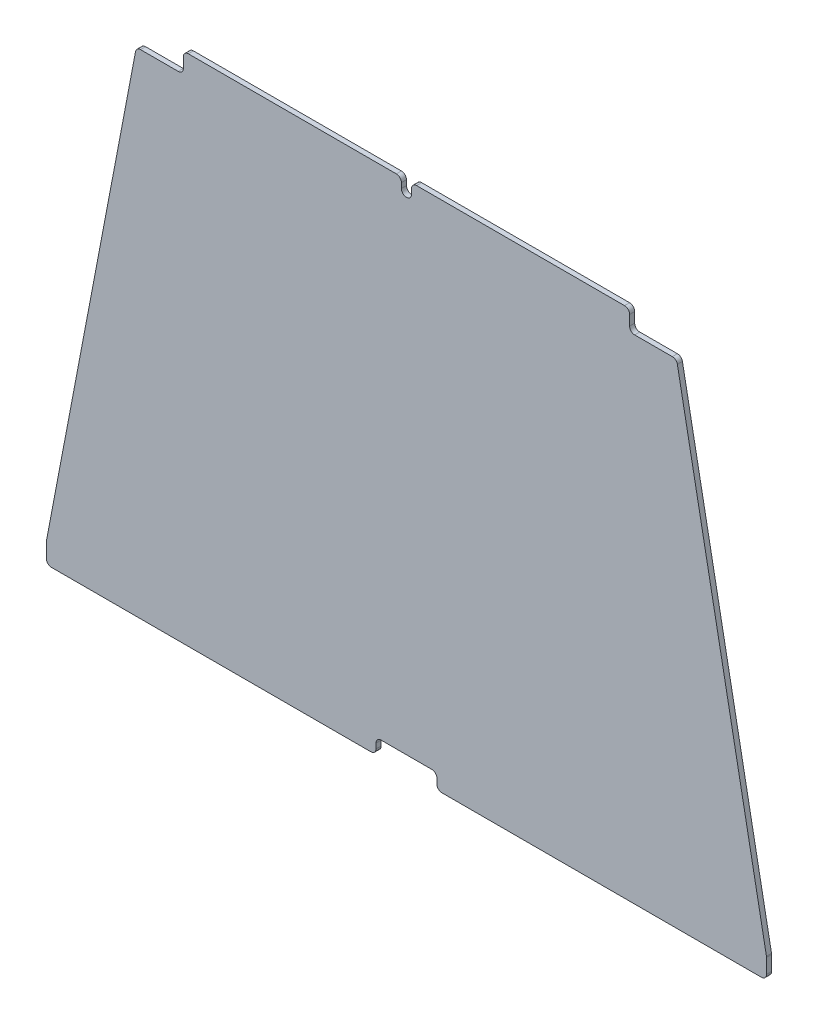
ISO-10303-21;
HEADER;
FILE_DESCRIPTION(('STEP AP214'),'2;1');
FILE_NAME('part.step','',(''),(''),'','','');
FILE_SCHEMA(('AUTOMOTIVE_DESIGN { 1 0 10303 214 1 1 1 1 }'));
ENDSEC;
DATA;
#1=APPLICATION_CONTEXT('core data for automotive mechanical design processes');
#2=APPLICATION_PROTOCOL_DEFINITION('international standard','automotive_design',2000,#1);
#3=PRODUCT_CONTEXT('',#1,'mechanical');
#4=PRODUCT('Part','Part','',(#3));
#5=PRODUCT_RELATED_PRODUCT_CATEGORY('part','',(#4));
#6=PRODUCT_DEFINITION_FORMATION('','',#4);
#7=PRODUCT_DEFINITION_CONTEXT('part definition',#1,'design');
#8=PRODUCT_DEFINITION('design','',#6,#7);
#9=PRODUCT_DEFINITION_SHAPE('','',#8);
#10=(LENGTH_UNIT() NAMED_UNIT(*) SI_UNIT(.MILLI.,.METRE.));
#11=(NAMED_UNIT(*) PLANE_ANGLE_UNIT() SI_UNIT($,.RADIAN.));
#12=(NAMED_UNIT(*) SI_UNIT($,.STERADIAN.) SOLID_ANGLE_UNIT());
#13=UNCERTAINTY_MEASURE_WITH_UNIT(LENGTH_MEASURE(1.E-05),#10,'distance_accuracy_value','');
#14=(GEOMETRIC_REPRESENTATION_CONTEXT(3) GLOBAL_UNCERTAINTY_ASSIGNED_CONTEXT((#13)) GLOBAL_UNIT_ASSIGNED_CONTEXT((#10,
#11,#12)) REPRESENTATION_CONTEXT('',''));
#15=CARTESIAN_POINT('',(0.,0.,0.));
#16=DIRECTION('',(0.,0.,1.));
#17=DIRECTION('',(1.,0.,0.));
#18=AXIS2_PLACEMENT_3D('',#15,#16,#17);
#19=CARTESIAN_POINT('',(355.,0.,5.));
#20=DIRECTION('',(0.,1.,0.));
#21=DIRECTION('',(0.,0.,1.));
#22=AXIS2_PLACEMENT_3D('',#19,#20,#21);
#23=PLANE('',#22);
#24=DIRECTION('',(1.,0.,0.));
#25=VECTOR('',#24,1.);
#26=CARTESIAN_POINT('',(355.,0.,5.));
#27=LINE('',#26,#25);
#28=CARTESIAN_POINT('',(35.0000000000001,0.,5.));
#29=VERTEX_POINT('',#28);
#30=CARTESIAN_POINT('',(350.,0.,5.));
#31=VERTEX_POINT('',#30);
#32=EDGE_CURVE('E371',#29,#31,#27,.T.);
#33=ORIENTED_EDGE('',*,*,#32,.F.);
#34=DIRECTION('',(0.,0.,1.));
#35=VECTOR('',#34,1.);
#36=CARTESIAN_POINT('',(35.0000000000001,0.,0.));
#37=LINE('',#36,#35);
#38=CARTESIAN_POINT('',(35.0000000000001,0.,0.));
#39=VERTEX_POINT('',#38);
#40=EDGE_CURVE('E498',#29,#39,#37,.F.);
#41=ORIENTED_EDGE('',*,*,#40,.T.);
#42=DIRECTION('',(1.,0.,0.));
#43=VECTOR('',#42,1.);
#44=CARTESIAN_POINT('',(355.,0.,0.));
#45=LINE('',#44,#43);
#46=CARTESIAN_POINT('',(350.,0.,0.));
#47=VERTEX_POINT('',#46);
#48=EDGE_CURVE('E451',#39,#47,#45,.T.);
#49=ORIENTED_EDGE('',*,*,#48,.T.);
#50=DIRECTION('',(0.,0.,-1.));
#51=VECTOR('',#50,1.);
#52=CARTESIAN_POINT('',(350.,0.,5.));
#53=LINE('',#52,#51);
#54=EDGE_CURVE('E496',#47,#31,#53,.F.);
#55=ORIENTED_EDGE('',*,*,#54,.T.);
#56=EDGE_LOOP('',(#33,#41,#49,#55));
#57=FACE_BOUND('',#56,.T.);
#58=ADVANCED_FACE('F37',(#57),#23,.F.);
#59=CARTESIAN_POINT('',(355.,19.9999999999999,5.));
#60=DIRECTION('',(-0.982365094756892,-0.186972780380684,0.));
#61=DIRECTION('',(0.186972780380684,-0.982365094756892,0.));
#62=AXIS2_PLACEMENT_3D('',#59,#60,#61);
#63=PLANE('',#62);
#64=DIRECTION('',(-0.186972780380684,0.982365094756892,0.));
#65=VECTOR('',#64,1.);
#66=CARTESIAN_POINT('',(355.,19.9999999999999,0.));
#67=LINE('',#66,#65);
#68=CARTESIAN_POINT('',(354.911825473784,20.4632737269271,0.));
#69=VERTEX_POINT('',#68);
#70=CARTESIAN_POINT('',(267.080298537189,481.934863901903,0.));
#71=VERTEX_POINT('',#70);
#72=EDGE_CURVE('E461',#69,#71,#67,.T.);
#73=ORIENTED_EDGE('',*,*,#72,.T.);
#74=DIRECTION('',(0.,0.,1.));
#75=VECTOR('',#74,1.);
#76=CARTESIAN_POINT('',(267.080298537189,481.934863901903,5.));
#77=LINE('',#76,#75);
#78=CARTESIAN_POINT('',(267.080298537189,481.934863901903,5.));
#79=VERTEX_POINT('',#78);
#80=EDGE_CURVE('E532',#71,#79,#77,.T.);
#81=ORIENTED_EDGE('',*,*,#80,.T.);
#82=DIRECTION('',(-0.186972780380684,0.982365094756892,0.));
#83=VECTOR('',#82,1.);
#84=CARTESIAN_POINT('',(355.,19.9999999999999,5.));
#85=LINE('',#84,#83);
#86=CARTESIAN_POINT('',(354.911825473784,20.4632737269271,5.));
#87=VERTEX_POINT('',#86);
#88=EDGE_CURVE('E313',#87,#79,#85,.T.);
#89=ORIENTED_EDGE('',*,*,#88,.F.);
#90=DIRECTION('',(0.,0.,-1.));
#91=VECTOR('',#90,1.);
#92=CARTESIAN_POINT('',(354.911825473784,20.4632737269271,5.));
#93=LINE('',#92,#91);
#94=EDGE_CURVE('E529',#87,#69,#93,.T.);
#95=ORIENTED_EDGE('',*,*,#94,.T.);
#96=EDGE_LOOP('',(#73,#81,#89,#95));
#97=FACE_BOUND('',#96,.T.);
#98=ADVANCED_FACE('F587',(#97),#63,.F.);
#99=CARTESIAN_POINT('',(-262.5,506.,5.));
#100=DIRECTION('',(0.,-1.,0.));
#101=DIRECTION('',(0.,0.,-1.));
#102=AXIS2_PLACEMENT_3D('',#99,#100,#101);
#103=PLANE('',#102);
#104=DIRECTION('',(-1.,0.,0.));
#105=VECTOR('',#104,1.);
#106=CARTESIAN_POINT('',(-262.5,506.,5.));
#107=LINE('',#106,#105);
#108=CARTESIAN_POINT('',(215.,506.,5.));
#109=VERTEX_POINT('',#108);
#110=CARTESIAN_POINT('',(9.99999999999995,506.,5.));
#111=VERTEX_POINT('',#110);
#112=EDGE_CURVE('E312',#109,#111,#107,.T.);
#113=ORIENTED_EDGE('',*,*,#112,.F.);
#114=DIRECTION('',(0.,0.,1.));
#115=VECTOR('',#114,1.);
#116=CARTESIAN_POINT('',(215.,506.,0.));
#117=LINE('',#116,#115);
#118=CARTESIAN_POINT('',(215.,506.,0.));
#119=VERTEX_POINT('',#118);
#120=EDGE_CURVE('E548',#109,#119,#117,.F.);
#121=ORIENTED_EDGE('',*,*,#120,.T.);
#122=DIRECTION('',(-1.,0.,0.));
#123=VECTOR('',#122,1.);
#124=CARTESIAN_POINT('',(-262.5,506.,0.));
#125=LINE('',#124,#123);
#126=CARTESIAN_POINT('',(9.99999999999995,506.,0.));
#127=VERTEX_POINT('',#126);
#128=EDGE_CURVE('E465',#119,#127,#125,.T.);
#129=ORIENTED_EDGE('',*,*,#128,.T.);
#130=DIRECTION('',(0.,0.,1.));
#131=VECTOR('',#130,1.);
#132=CARTESIAN_POINT('',(9.99999999999995,506.,5.));
#133=LINE('',#132,#131);
#134=EDGE_CURVE('E545',#127,#111,#133,.T.);
#135=ORIENTED_EDGE('',*,*,#134,.T.);
#136=EDGE_LOOP('',(#113,#121,#129,#135));
#137=FACE_BOUND('',#136,.T.);
#138=ADVANCED_FACE('F594',(#137),#103,.F.);
#139=CARTESIAN_POINT('',(-10.0000000000001,506.,5.));
#140=VERTEX_POINT('',#139);
#141=CARTESIAN_POINT('',(-215.,506.,5.));
#142=VERTEX_POINT('',#141);
#143=EDGE_CURVE('E307',#140,#142,#107,.T.);
#144=ORIENTED_EDGE('',*,*,#143,.F.);
#145=DIRECTION('',(0.,0.,1.));
#146=VECTOR('',#145,1.);
#147=CARTESIAN_POINT('',(-10.0000000000001,506.,0.));
#148=LINE('',#147,#146);
#149=CARTESIAN_POINT('',(-10.0000000000001,506.,0.));
#150=VERTEX_POINT('',#149);
#151=EDGE_CURVE('E557',#140,#150,#148,.F.);
#152=ORIENTED_EDGE('',*,*,#151,.T.);
#153=CARTESIAN_POINT('',(-215.,506.,0.));
#154=VERTEX_POINT('',#153);
#155=EDGE_CURVE('E464',#150,#154,#125,.T.);
#156=ORIENTED_EDGE('',*,*,#155,.T.);
#157=DIRECTION('',(0.,0.,1.));
#158=VECTOR('',#157,1.);
#159=CARTESIAN_POINT('',(-215.,506.,5.));
#160=LINE('',#159,#158);
#161=EDGE_CURVE('E554',#154,#142,#160,.T.);
#162=ORIENTED_EDGE('',*,*,#161,.T.);
#163=EDGE_LOOP('',(#144,#152,#156,#162));
#164=FACE_BOUND('',#163,.T.);
#165=ADVANCED_FACE('F571',(#164),#103,.F.);
#166=CARTESIAN_POINT('',(0.,0.,5.));
#167=DIRECTION('',(0.,0.,-1.));
#168=DIRECTION('',(-1.,0.,0.));
#169=AXIS2_PLACEMENT_3D('',#166,#167,#168);
#170=PLANE('',#169);
#171=DIRECTION('',(0.,-1.,0.));
#172=VECTOR('',#171,1.);
#173=CARTESIAN_POINT('',(30.0000000000001,0.,5.));
#174=LINE('',#173,#172);
#175=CARTESIAN_POINT('',(30.0000000000001,10.,5.));
#176=VERTEX_POINT('',#175);
#177=CARTESIAN_POINT('',(30.0000000000001,4.99999999999994,5.));
#178=VERTEX_POINT('',#177);
#179=EDGE_CURVE('E350',#176,#178,#174,.T.);
#180=ORIENTED_EDGE('',*,*,#179,.T.);
#181=CARTESIAN_POINT('',(35.0000000000001,4.99999999999994,5.));
#182=DIRECTION('',(0.,0.,-1.));
#183=DIRECTION('',(-1.,0.,0.));
#184=AXIS2_PLACEMENT_3D('',#181,#182,#183);
#185=CIRCLE('',#184,5.);
#186=EDGE_CURVE('E494',#178,#29,#185,.F.);
#187=ORIENTED_EDGE('',*,*,#186,.T.);
#188=ORIENTED_EDGE('',*,*,#32,.T.);
#189=CARTESIAN_POINT('',(350.,4.99999999999994,5.));
#190=DIRECTION('',(0.,0.,-1.));
#191=DIRECTION('',(-1.,0.,0.));
#192=AXIS2_PLACEMENT_3D('',#189,#190,#191);
#193=CIRCLE('',#192,5.);
#194=CARTESIAN_POINT('',(355.,4.99999999999994,5.));
#195=VERTEX_POINT('',#194);
#196=EDGE_CURVE('E472',#31,#195,#193,.F.);
#197=ORIENTED_EDGE('',*,*,#196,.T.);
#198=DIRECTION('',(0.,1.,0.));
#199=VECTOR('',#198,1.);
#200=CARTESIAN_POINT('',(355.,0.,5.));
#201=LINE('',#200,#199);
#202=CARTESIAN_POINT('',(355.,19.5284098250237,5.));
#203=VERTEX_POINT('',#202);
#204=EDGE_CURVE('E654',#195,#203,#201,.T.);
#205=ORIENTED_EDGE('',*,*,#204,.T.);
#206=CARTESIAN_POINT('',(350.,19.5284098250237,5.));
#207=DIRECTION('',(0.,0.,-1.));
#208=DIRECTION('',(-1.,0.,0.));
#209=AXIS2_PLACEMENT_3D('',#206,#207,#208);
#210=CIRCLE('',#209,5.);
#211=EDGE_CURVE('E478',#203,#87,#210,.F.);
#212=ORIENTED_EDGE('',*,*,#211,.T.);
#213=ORIENTED_EDGE('',*,*,#88,.T.);
#214=CARTESIAN_POINT('',(262.168473063405,481.,5.));
#215=DIRECTION('',(0.,0.,-1.));
#216=DIRECTION('',(-1.,0.,0.));
#217=AXIS2_PLACEMENT_3D('',#214,#215,#216);
#218=CIRCLE('',#217,5.);
#219=CARTESIAN_POINT('',(262.168473063405,486.,5.));
#220=VERTEX_POINT('',#219);
#221=EDGE_CURVE('E490',#79,#220,#218,.F.);
#222=ORIENTED_EDGE('',*,*,#221,.T.);
#223=DIRECTION('',(-1.,0.,0.));
#224=VECTOR('',#223,1.);
#225=CARTESIAN_POINT('',(0.,486.,5.));
#226=LINE('',#225,#224);
#227=CARTESIAN_POINT('',(225.,486.,5.));
#228=VERTEX_POINT('',#227);
#229=EDGE_CURVE('E325',#220,#228,#226,.T.);
#230=ORIENTED_EDGE('',*,*,#229,.T.);
#231=CARTESIAN_POINT('',(225.,491.,5.));
#232=DIRECTION('',(0.,0.,-1.));
#233=DIRECTION('',(-1.,0.,0.));
#234=AXIS2_PLACEMENT_3D('',#231,#232,#233);
#235=CIRCLE('',#234,5.);
#236=CARTESIAN_POINT('',(220.,491.,5.));
#237=VERTEX_POINT('',#236);
#238=EDGE_CURVE('E399',#228,#237,#235,.T.);
#239=ORIENTED_EDGE('',*,*,#238,.T.);
#240=DIRECTION('',(0.,1.,0.));
#241=VECTOR('',#240,1.);
#242=CARTESIAN_POINT('',(220.,0.,5.));
#243=LINE('',#242,#241);
#244=CARTESIAN_POINT('',(220.,501.,5.));
#245=VERTEX_POINT('',#244);
#246=EDGE_CURVE('E290',#237,#245,#243,.T.);
#247=ORIENTED_EDGE('',*,*,#246,.T.);
#248=CARTESIAN_POINT('',(215.,501.,5.));
#249=DIRECTION('',(0.,0.,-1.));
#250=DIRECTION('',(-1.,0.,0.));
#251=AXIS2_PLACEMENT_3D('',#248,#249,#250);
#252=CIRCLE('',#251,5.);
#253=EDGE_CURVE('E488',#245,#109,#252,.F.);
#254=ORIENTED_EDGE('',*,*,#253,.T.);
#255=ORIENTED_EDGE('',*,*,#112,.T.);
#256=CARTESIAN_POINT('',(9.99999999999995,501.,5.));
#257=DIRECTION('',(0.,0.,-1.));
#258=DIRECTION('',(-1.,0.,0.));
#259=AXIS2_PLACEMENT_3D('',#256,#257,#258);
#260=CIRCLE('',#259,5.);
#261=CARTESIAN_POINT('',(4.99999999999995,501.,5.));
#262=VERTEX_POINT('',#261);
#263=EDGE_CURVE('E486',#111,#262,#260,.F.);
#264=ORIENTED_EDGE('',*,*,#263,.T.);
#265=DIRECTION('',(0.,1.,0.));
#266=VECTOR('',#265,1.);
#267=CARTESIAN_POINT('',(4.9999999999999,0.,5.));
#268=LINE('',#267,#266);
#269=CARTESIAN_POINT('',(4.99999999999995,496.,5.));
#270=VERTEX_POINT('',#269);
#271=EDGE_CURVE('E284',#270,#262,#268,.T.);
#272=ORIENTED_EDGE('',*,*,#271,.F.);
#273=CARTESIAN_POINT('',(0.,496.,5.));
#274=DIRECTION('',(0.,0.,1.));
#275=DIRECTION('',(1.,0.,0.));
#276=AXIS2_PLACEMENT_3D('',#273,#274,#275);
#277=CIRCLE('',#276,5.);
#278=CARTESIAN_POINT('',(-5.00000000000006,496.,5.));
#279=VERTEX_POINT('',#278);
#280=EDGE_CURVE('E287',#279,#270,#277,.T.);
#281=ORIENTED_EDGE('',*,*,#280,.F.);
#282=DIRECTION('',(0.,1.,0.));
#283=VECTOR('',#282,1.);
#284=CARTESIAN_POINT('',(-5.00000000000001,0.,5.));
#285=LINE('',#284,#283);
#286=CARTESIAN_POINT('',(-5.00000000000006,501.,5.));
#287=VERTEX_POINT('',#286);
#288=EDGE_CURVE('E266',#279,#287,#285,.T.);
#289=ORIENTED_EDGE('',*,*,#288,.T.);
#290=CARTESIAN_POINT('',(-10.0000000000001,501.,5.));
#291=DIRECTION('',(0.,0.,-1.));
#292=DIRECTION('',(-1.,0.,0.));
#293=AXIS2_PLACEMENT_3D('',#290,#291,#292);
#294=CIRCLE('',#293,5.);
#295=EDGE_CURVE('E484',#287,#140,#294,.F.);
#296=ORIENTED_EDGE('',*,*,#295,.T.);
#297=ORIENTED_EDGE('',*,*,#143,.T.);
#298=CARTESIAN_POINT('',(-215.,501.,5.));
#299=DIRECTION('',(0.,0.,-1.));
#300=DIRECTION('',(-1.,0.,0.));
#301=AXIS2_PLACEMENT_3D('',#298,#299,#300);
#302=CIRCLE('',#301,5.);
#303=CARTESIAN_POINT('',(-220.,501.,5.));
#304=VERTEX_POINT('',#303);
#305=EDGE_CURVE('E482',#142,#304,#302,.F.);
#306=ORIENTED_EDGE('',*,*,#305,.T.);
#307=DIRECTION('',(0.,1.,0.));
#308=VECTOR('',#307,1.);
#309=CARTESIAN_POINT('',(-220.,0.,5.));
#310=LINE('',#309,#308);
#311=CARTESIAN_POINT('',(-220.,491.,5.));
#312=VERTEX_POINT('',#311);
#313=EDGE_CURVE('E381',#312,#304,#310,.T.);
#314=ORIENTED_EDGE('',*,*,#313,.F.);
#315=CARTESIAN_POINT('',(-225.,491.,5.));
#316=DIRECTION('',(0.,0.,-1.));
#317=DIRECTION('',(-1.,0.,0.));
#318=AXIS2_PLACEMENT_3D('',#315,#316,#317);
#319=CIRCLE('',#318,5.);
#320=CARTESIAN_POINT('',(-225.,486.,5.));
#321=VERTEX_POINT('',#320);
#322=EDGE_CURVE('E45',#312,#321,#319,.T.);
#323=ORIENTED_EDGE('',*,*,#322,.T.);
#324=DIRECTION('',(1.,0.,0.));
#325=VECTOR('',#324,1.);
#326=CARTESIAN_POINT('',(0.,486.,5.));
#327=LINE('',#326,#325);
#328=CARTESIAN_POINT('',(-262.168473063405,486.,5.));
#329=VERTEX_POINT('',#328);
#330=EDGE_CURVE('E377',#329,#321,#327,.T.);
#331=ORIENTED_EDGE('',*,*,#330,.F.);
#332=CARTESIAN_POINT('',(-262.168473063405,481.,5.));
#333=DIRECTION('',(0.,0.,-1.));
#334=DIRECTION('',(-1.,0.,0.));
#335=AXIS2_PLACEMENT_3D('',#332,#333,#334);
#336=CIRCLE('',#335,5.);
#337=CARTESIAN_POINT('',(-267.080298537189,481.934863901903,5.));
#338=VERTEX_POINT('',#337);
#339=EDGE_CURVE('E480',#329,#338,#336,.F.);
#340=ORIENTED_EDGE('',*,*,#339,.T.);
#341=DIRECTION('',(-0.186972780380684,-0.982365094756892,0.));
#342=VECTOR('',#341,1.);
#343=CARTESIAN_POINT('',(-355.,19.9999999999999,5.));
#344=LINE('',#343,#342);
#345=CARTESIAN_POINT('',(-354.911825473784,20.4632737269271,5.));
#346=VERTEX_POINT('',#345);
#347=EDGE_CURVE('E316',#338,#346,#344,.T.);
#348=ORIENTED_EDGE('',*,*,#347,.T.);
#349=CARTESIAN_POINT('',(-350.,19.5284098250237,5.));
#350=DIRECTION('',(0.,0.,-1.));
#351=DIRECTION('',(-1.,0.,0.));
#352=AXIS2_PLACEMENT_3D('',#349,#350,#351);
#353=CIRCLE('',#352,5.);
#354=CARTESIAN_POINT('',(-355.,19.5284098250237,5.));
#355=VERTEX_POINT('',#354);
#356=EDGE_CURVE('E476',#346,#355,#353,.F.);
#357=ORIENTED_EDGE('',*,*,#356,.T.);
#358=DIRECTION('',(0.,-1.,0.));
#359=VECTOR('',#358,1.);
#360=CARTESIAN_POINT('',(-355.,0.,5.));
#361=LINE('',#360,#359);
#362=CARTESIAN_POINT('',(-355.,4.99999999999994,5.));
#363=VERTEX_POINT('',#362);
#364=EDGE_CURVE('E368',#355,#363,#361,.T.);
#365=ORIENTED_EDGE('',*,*,#364,.T.);
#366=CARTESIAN_POINT('',(-350.,4.99999999999994,5.));
#367=DIRECTION('',(0.,0.,-1.));
#368=DIRECTION('',(-1.,0.,0.));
#369=AXIS2_PLACEMENT_3D('',#366,#367,#368);
#370=CIRCLE('',#369,5.);
#371=CARTESIAN_POINT('',(-350.,0.,5.));
#372=VERTEX_POINT('',#371);
#373=EDGE_CURVE('E474',#363,#372,#370,.F.);
#374=ORIENTED_EDGE('',*,*,#373,.T.);
#375=CARTESIAN_POINT('',(-35.0000000000001,0.,5.));
#376=VERTEX_POINT('',#375);
#377=EDGE_CURVE('E618',#372,#376,#27,.T.);
#378=ORIENTED_EDGE('',*,*,#377,.T.);
#379=CARTESIAN_POINT('',(-35.0000000000001,4.99999999999994,5.));
#380=DIRECTION('',(0.,0.,-1.));
#381=DIRECTION('',(-1.,0.,0.));
#382=AXIS2_PLACEMENT_3D('',#379,#380,#381);
#383=CIRCLE('',#382,5.);
#384=CARTESIAN_POINT('',(-30.0000000000001,4.99999999999994,5.));
#385=VERTEX_POINT('',#384);
#386=EDGE_CURVE('E492',#376,#385,#383,.F.);
#387=ORIENTED_EDGE('',*,*,#386,.T.);
#388=DIRECTION('',(0.,-1.,0.));
#389=VECTOR('',#388,1.);
#390=CARTESIAN_POINT('',(-30.0000000000001,0.,5.));
#391=LINE('',#390,#389);
#392=CARTESIAN_POINT('',(-30.0000000000001,10.,5.));
#393=VERTEX_POINT('',#392);
#394=EDGE_CURVE('E346',#393,#385,#391,.T.);
#395=ORIENTED_EDGE('',*,*,#394,.F.);
#396=CARTESIAN_POINT('',(-24.9999999999999,10.,5.));
#397=DIRECTION('',(0.,0.,1.));
#398=DIRECTION('',(1.,0.,0.));
#399=AXIS2_PLACEMENT_3D('',#396,#397,#398);
#400=CIRCLE('',#399,5.00000000000006);
#401=CARTESIAN_POINT('',(-24.9999999999999,15.,5.));
#402=VERTEX_POINT('',#401);
#403=EDGE_CURVE('E343',#393,#402,#400,.F.);
#404=ORIENTED_EDGE('',*,*,#403,.T.);
#405=DIRECTION('',(-1.,0.,0.));
#406=VECTOR('',#405,1.);
#407=CARTESIAN_POINT('',(0.,15.,5.));
#408=LINE('',#407,#406);
#409=CARTESIAN_POINT('',(25.0000000000001,15.,5.));
#410=VERTEX_POINT('',#409);
#411=EDGE_CURVE('E330',#410,#402,#408,.T.);
#412=ORIENTED_EDGE('',*,*,#411,.F.);
#413=CARTESIAN_POINT('',(25.0000000000001,10.,5.));
#414=DIRECTION('',(0.,0.,1.));
#415=DIRECTION('',(1.,0.,0.));
#416=AXIS2_PLACEMENT_3D('',#413,#414,#415);
#417=CIRCLE('',#416,5.);
#418=EDGE_CURVE('E360',#176,#410,#417,.T.);
#419=ORIENTED_EDGE('',*,*,#418,.F.);
#420=EDGE_LOOP('',(#180,#187,#188,#197,#205,#212,#213,#222,#230,#239,#247,#254,#255,#264,#272,
#281,#289,#296,#297,#306,#314,#323,#331,#340,#348,#357,#365,#374,#378,#387,#395,#404,#412,#419));
#421=FACE_BOUND('',#420,.T.);
#422=ADVANCED_FACE('F411',(#421),#170,.F.);
#423=CARTESIAN_POINT('',(0.,0.,0.));
#424=DIRECTION('',(0.,0.,-1.));
#425=DIRECTION('',(-1.,0.,0.));
#426=AXIS2_PLACEMENT_3D('',#423,#424,#425);
#427=PLANE('',#426);
#428=ORIENTED_EDGE('',*,*,#48,.F.);
#429=CARTESIAN_POINT('',(35.0000000000001,4.99999999999994,0.));
#430=DIRECTION('',(0.,0.,-1.));
#431=DIRECTION('',(-1.,0.,0.));
#432=AXIS2_PLACEMENT_3D('',#429,#430,#431);
#433=CIRCLE('',#432,5.);
#434=CARTESIAN_POINT('',(30.0000000000001,4.99999999999994,0.));
#435=VERTEX_POINT('',#434);
#436=EDGE_CURVE('E519',#39,#435,#433,.T.);
#437=ORIENTED_EDGE('',*,*,#436,.T.);
#438=DIRECTION('',(0.,-1.,0.));
#439=VECTOR('',#438,1.);
#440=CARTESIAN_POINT('',(30.0000000000001,0.,0.));
#441=LINE('',#440,#439);
#442=CARTESIAN_POINT('',(30.0000000000001,10.,0.));
#443=VERTEX_POINT('',#442);
#444=EDGE_CURVE('E333',#443,#435,#441,.T.);
#445=ORIENTED_EDGE('',*,*,#444,.F.);
#446=CARTESIAN_POINT('',(25.0000000000001,10.,0.));
#447=DIRECTION('',(0.,0.,1.));
#448=DIRECTION('',(1.,0.,0.));
#449=AXIS2_PLACEMENT_3D('',#446,#447,#448);
#450=CIRCLE('',#449,5.);
#451=CARTESIAN_POINT('',(25.0000000000001,15.,0.));
#452=VERTEX_POINT('',#451);
#453=EDGE_CURVE('E336',#443,#452,#450,.T.);
#454=ORIENTED_EDGE('',*,*,#453,.T.);
#455=DIRECTION('',(-1.,0.,0.));
#456=VECTOR('',#455,1.);
#457=CARTESIAN_POINT('',(0.,15.,0.));
#458=LINE('',#457,#456);
#459=CARTESIAN_POINT('',(-24.9999999999999,15.,0.));
#460=VERTEX_POINT('',#459);
#461=EDGE_CURVE('E339',#452,#460,#458,.T.);
#462=ORIENTED_EDGE('',*,*,#461,.T.);
#463=CARTESIAN_POINT('',(-24.9999999999999,10.,0.));
#464=DIRECTION('',(0.,0.,1.));
#465=DIRECTION('',(1.,0.,0.));
#466=AXIS2_PLACEMENT_3D('',#463,#464,#465);
#467=CIRCLE('',#466,5.00000000000006);
#468=CARTESIAN_POINT('',(-30.0000000000001,10.,0.));
#469=VERTEX_POINT('',#468);
#470=EDGE_CURVE('E327',#469,#460,#467,.F.);
#471=ORIENTED_EDGE('',*,*,#470,.F.);
#472=DIRECTION('',(0.,-1.,0.));
#473=VECTOR('',#472,1.);
#474=CARTESIAN_POINT('',(-30.0000000000001,0.,0.));
#475=LINE('',#474,#473);
#476=CARTESIAN_POINT('',(-30.0000000000001,4.99999999999994,0.));
#477=VERTEX_POINT('',#476);
#478=EDGE_CURVE('E329',#469,#477,#475,.T.);
#479=ORIENTED_EDGE('',*,*,#478,.T.);
#480=CARTESIAN_POINT('',(-35.0000000000001,4.99999999999994,0.));
#481=DIRECTION('',(0.,0.,-1.));
#482=DIRECTION('',(-1.,0.,0.));
#483=AXIS2_PLACEMENT_3D('',#480,#481,#482);
#484=CIRCLE('',#483,5.);
#485=CARTESIAN_POINT('',(-35.0000000000001,0.,0.));
#486=VERTEX_POINT('',#485);
#487=EDGE_CURVE('E517',#477,#486,#484,.T.);
#488=ORIENTED_EDGE('',*,*,#487,.T.);
#489=CARTESIAN_POINT('',(-350.,0.,0.));
#490=VERTEX_POINT('',#489);
#491=EDGE_CURVE('E453',#490,#486,#45,.T.);
#492=ORIENTED_EDGE('',*,*,#491,.F.);
#493=CARTESIAN_POINT('',(-350.,4.99999999999994,0.));
#494=DIRECTION('',(0.,0.,-1.));
#495=DIRECTION('',(-1.,0.,0.));
#496=AXIS2_PLACEMENT_3D('',#493,#494,#495);
#497=CIRCLE('',#496,5.);
#498=CARTESIAN_POINT('',(-355.,4.99999999999994,0.));
#499=VERTEX_POINT('',#498);
#500=EDGE_CURVE('E450',#490,#499,#497,.T.);
#501=ORIENTED_EDGE('',*,*,#500,.T.);
#502=DIRECTION('',(0.,-1.,0.));
#503=VECTOR('',#502,1.);
#504=CARTESIAN_POINT('',(-355.,0.,0.));
#505=LINE('',#504,#503);
#506=CARTESIAN_POINT('',(-355.,19.5284098250237,0.));
#507=VERTEX_POINT('',#506);
#508=EDGE_CURVE('E446',#507,#499,#505,.T.);
#509=ORIENTED_EDGE('',*,*,#508,.F.);
#510=CARTESIAN_POINT('',(-350.,19.5284098250237,0.));
#511=DIRECTION('',(0.,0.,-1.));
#512=DIRECTION('',(-1.,0.,0.));
#513=AXIS2_PLACEMENT_3D('',#510,#511,#512);
#514=CIRCLE('',#513,5.);
#515=CARTESIAN_POINT('',(-354.911825473784,20.4632737269271,0.));
#516=VERTEX_POINT('',#515);
#517=EDGE_CURVE('E52',#507,#516,#514,.T.);
#518=ORIENTED_EDGE('',*,*,#517,.T.);
#519=DIRECTION('',(-0.186972780380684,-0.982365094756892,0.));
#520=VECTOR('',#519,1.);
#521=CARTESIAN_POINT('',(-355.,19.9999999999999,0.));
#522=LINE('',#521,#520);
#523=CARTESIAN_POINT('',(-267.080298537189,481.934863901903,0.));
#524=VERTEX_POINT('',#523);
#525=EDGE_CURVE('E372',#524,#516,#522,.T.);
#526=ORIENTED_EDGE('',*,*,#525,.F.);
#527=CARTESIAN_POINT('',(-262.168473063405,481.,0.));
#528=DIRECTION('',(0.,0.,-1.));
#529=DIRECTION('',(-1.,0.,0.));
#530=AXIS2_PLACEMENT_3D('',#527,#528,#529);
#531=CIRCLE('',#530,5.);
#532=CARTESIAN_POINT('',(-262.168473063405,486.,0.));
#533=VERTEX_POINT('',#532);
#534=EDGE_CURVE('E506',#524,#533,#531,.T.);
#535=ORIENTED_EDGE('',*,*,#534,.T.);
#536=DIRECTION('',(1.,0.,0.));
#537=VECTOR('',#536,1.);
#538=CARTESIAN_POINT('',(0.,486.,0.));
#539=LINE('',#538,#537);
#540=CARTESIAN_POINT('',(-225.,486.,0.));
#541=VERTEX_POINT('',#540);
#542=EDGE_CURVE('E388',#533,#541,#539,.T.);
#543=ORIENTED_EDGE('',*,*,#542,.T.);
#544=CARTESIAN_POINT('',(-225.,491.,0.));
#545=DIRECTION('',(0.,0.,-1.));
#546=DIRECTION('',(-1.,0.,0.));
#547=AXIS2_PLACEMENT_3D('',#544,#545,#546);
#548=CIRCLE('',#547,5.);
#549=CARTESIAN_POINT('',(-220.,491.,0.));
#550=VERTEX_POINT('',#549);
#551=EDGE_CURVE('E12',#541,#550,#548,.F.);
#552=ORIENTED_EDGE('',*,*,#551,.T.);
#553=DIRECTION('',(0.,1.,0.));
#554=VECTOR('',#553,1.);
#555=CARTESIAN_POINT('',(-220.,0.,0.));
#556=LINE('',#555,#554);
#557=CARTESIAN_POINT('',(-220.,501.,0.));
#558=VERTEX_POINT('',#557);
#559=EDGE_CURVE('E383',#550,#558,#556,.T.);
#560=ORIENTED_EDGE('',*,*,#559,.T.);
#561=CARTESIAN_POINT('',(-215.,501.,0.));
#562=DIRECTION('',(0.,0.,-1.));
#563=DIRECTION('',(-1.,0.,0.));
#564=AXIS2_PLACEMENT_3D('',#561,#562,#563);
#565=CIRCLE('',#564,5.);
#566=EDGE_CURVE('E508',#558,#154,#565,.T.);
#567=ORIENTED_EDGE('',*,*,#566,.T.);
#568=ORIENTED_EDGE('',*,*,#155,.F.);
#569=CARTESIAN_POINT('',(-10.0000000000001,501.,0.));
#570=DIRECTION('',(0.,0.,-1.));
#571=DIRECTION('',(-1.,0.,0.));
#572=AXIS2_PLACEMENT_3D('',#569,#570,#571);
#573=CIRCLE('',#572,5.);
#574=CARTESIAN_POINT('',(-5.00000000000006,501.,0.));
#575=VERTEX_POINT('',#574);
#576=EDGE_CURVE('E283',#150,#575,#573,.T.);
#577=ORIENTED_EDGE('',*,*,#576,.T.);
#578=DIRECTION('',(0.,1.,0.));
#579=VECTOR('',#578,1.);
#580=CARTESIAN_POINT('',(-5.00000000000001,0.,0.));
#581=LINE('',#580,#579);
#582=CARTESIAN_POINT('',(-5.00000000000006,496.,0.));
#583=VERTEX_POINT('',#582);
#584=EDGE_CURVE('E263',#583,#575,#581,.T.);
#585=ORIENTED_EDGE('',*,*,#584,.F.);
#586=CARTESIAN_POINT('',(0.,496.,0.));
#587=DIRECTION('',(0.,0.,1.));
#588=DIRECTION('',(1.,0.,0.));
#589=AXIS2_PLACEMENT_3D('',#586,#587,#588);
#590=CIRCLE('',#589,5.);
#591=CARTESIAN_POINT('',(4.99999999999995,496.,0.));
#592=VERTEX_POINT('',#591);
#593=EDGE_CURVE('E275',#583,#592,#590,.T.);
#594=ORIENTED_EDGE('',*,*,#593,.T.);
#595=DIRECTION('',(0.,1.,0.));
#596=VECTOR('',#595,1.);
#597=CARTESIAN_POINT('',(4.9999999999999,0.,0.));
#598=LINE('',#597,#596);
#599=CARTESIAN_POINT('',(4.99999999999995,501.,0.));
#600=VERTEX_POINT('',#599);
#601=EDGE_CURVE('E271',#592,#600,#598,.T.);
#602=ORIENTED_EDGE('',*,*,#601,.T.);
#603=CARTESIAN_POINT('',(9.99999999999995,501.,0.));
#604=DIRECTION('',(0.,0.,-1.));
#605=DIRECTION('',(-1.,0.,0.));
#606=AXIS2_PLACEMENT_3D('',#603,#604,#605);
#607=CIRCLE('',#606,5.);
#608=EDGE_CURVE('E511',#600,#127,#607,.T.);
#609=ORIENTED_EDGE('',*,*,#608,.T.);
#610=ORIENTED_EDGE('',*,*,#128,.F.);
#611=CARTESIAN_POINT('',(215.,501.,0.));
#612=DIRECTION('',(0.,0.,-1.));
#613=DIRECTION('',(-1.,0.,0.));
#614=AXIS2_PLACEMENT_3D('',#611,#612,#613);
#615=CIRCLE('',#614,5.);
#616=CARTESIAN_POINT('',(220.,501.,0.));
#617=VERTEX_POINT('',#616);
#618=EDGE_CURVE('E513',#119,#617,#615,.T.);
#619=ORIENTED_EDGE('',*,*,#618,.T.);
#620=DIRECTION('',(0.,1.,0.));
#621=VECTOR('',#620,1.);
#622=CARTESIAN_POINT('',(220.,0.,0.));
#623=LINE('',#622,#621);
#624=CARTESIAN_POINT('',(220.,491.,0.));
#625=VERTEX_POINT('',#624);
#626=EDGE_CURVE('E382',#625,#617,#623,.T.);
#627=ORIENTED_EDGE('',*,*,#626,.F.);
#628=CARTESIAN_POINT('',(225.,491.,0.));
#629=DIRECTION('',(0.,0.,-1.));
#630=DIRECTION('',(-1.,0.,0.));
#631=AXIS2_PLACEMENT_3D('',#628,#629,#630);
#632=CIRCLE('',#631,5.);
#633=CARTESIAN_POINT('',(225.,486.,0.));
#634=VERTEX_POINT('',#633);
#635=EDGE_CURVE('E403',#625,#634,#632,.F.);
#636=ORIENTED_EDGE('',*,*,#635,.T.);
#637=DIRECTION('',(-1.,0.,0.));
#638=VECTOR('',#637,1.);
#639=CARTESIAN_POINT('',(0.,486.,0.));
#640=LINE('',#639,#638);
#641=CARTESIAN_POINT('',(262.168473063405,486.,0.));
#642=VERTEX_POINT('',#641);
#643=EDGE_CURVE('E389',#642,#634,#640,.T.);
#644=ORIENTED_EDGE('',*,*,#643,.F.);
#645=CARTESIAN_POINT('',(262.168473063405,481.,0.));
#646=DIRECTION('',(0.,0.,-1.));
#647=DIRECTION('',(-1.,0.,0.));
#648=AXIS2_PLACEMENT_3D('',#645,#646,#647);
#649=CIRCLE('',#648,5.);
#650=EDGE_CURVE('E515',#642,#71,#649,.T.);
#651=ORIENTED_EDGE('',*,*,#650,.T.);
#652=ORIENTED_EDGE('',*,*,#72,.F.);
#653=CARTESIAN_POINT('',(350.,19.5284098250237,0.));
#654=DIRECTION('',(0.,0.,-1.));
#655=DIRECTION('',(-1.,0.,0.));
#656=AXIS2_PLACEMENT_3D('',#653,#654,#655);
#657=CIRCLE('',#656,5.);
#658=CARTESIAN_POINT('',(355.,19.5284098250237,0.));
#659=VERTEX_POINT('',#658);
#660=EDGE_CURVE('E504',#69,#659,#657,.T.);
#661=ORIENTED_EDGE('',*,*,#660,.T.);
#662=DIRECTION('',(0.,1.,0.));
#663=VECTOR('',#662,1.);
#664=CARTESIAN_POINT('',(355.,0.,0.));
#665=LINE('',#664,#663);
#666=CARTESIAN_POINT('',(355.,4.99999999999994,0.));
#667=VERTEX_POINT('',#666);
#668=EDGE_CURVE('E458',#667,#659,#665,.T.);
#669=ORIENTED_EDGE('',*,*,#668,.F.);
#670=CARTESIAN_POINT('',(350.,4.99999999999994,0.));
#671=DIRECTION('',(0.,0.,-1.));
#672=DIRECTION('',(-1.,0.,0.));
#673=AXIS2_PLACEMENT_3D('',#670,#671,#672);
#674=CIRCLE('',#673,5.);
#675=EDGE_CURVE('E500',#667,#47,#674,.T.);
#676=ORIENTED_EDGE('',*,*,#675,.T.);
#677=EDGE_LOOP('',(#428,#437,#445,#454,#462,#471,#479,#488,#492,#501,#509,#518,#526,#535,#543,
#552,#560,#567,#568,#577,#585,#594,#602,#609,#610,#619,#627,#636,#644,#651,#652,#661,#669,#676));
#678=FACE_BOUND('',#677,.T.);
#679=ADVANCED_FACE('F280',(#678),#427,.T.);
#680=CARTESIAN_POINT('',(-355.,0.,5.));
#681=DIRECTION('',(1.,0.,0.));
#682=DIRECTION('',(0.,0.,-1.));
#683=AXIS2_PLACEMENT_3D('',#680,#681,#682);
#684=PLANE('',#683);
#685=ORIENTED_EDGE('',*,*,#364,.F.);
#686=DIRECTION('',(0.,0.,-1.));
#687=VECTOR('',#686,1.);
#688=CARTESIAN_POINT('',(-355.,19.5284098250237,5.));
#689=LINE('',#688,#687);
#690=EDGE_CURVE('E404',#355,#507,#689,.T.);
#691=ORIENTED_EDGE('',*,*,#690,.T.);
#692=ORIENTED_EDGE('',*,*,#508,.T.);
#693=DIRECTION('',(0.,0.,-1.));
#694=VECTOR('',#693,1.);
#695=CARTESIAN_POINT('',(-355.,4.99999999999994,5.));
#696=LINE('',#695,#694);
#697=EDGE_CURVE('E438',#499,#363,#696,.F.);
#698=ORIENTED_EDGE('',*,*,#697,.T.);
#699=EDGE_LOOP('',(#685,#691,#692,#698));
#700=FACE_BOUND('',#699,.T.);
#701=ADVANCED_FACE('F445',(#700),#684,.F.);
#702=ORIENTED_EDGE('',*,*,#491,.T.);
#703=DIRECTION('',(0.,0.,1.));
#704=VECTOR('',#703,1.);
#705=CARTESIAN_POINT('',(-35.0000000000001,0.,5.));
#706=LINE('',#705,#704);
#707=EDGE_CURVE('E524',#486,#376,#706,.T.);
#708=ORIENTED_EDGE('',*,*,#707,.T.);
#709=ORIENTED_EDGE('',*,*,#377,.F.);
#710=DIRECTION('',(0.,0.,-1.));
#711=VECTOR('',#710,1.);
#712=CARTESIAN_POINT('',(-350.,0.,5.));
#713=LINE('',#712,#711);
#714=EDGE_CURVE('E521',#372,#490,#713,.T.);
#715=ORIENTED_EDGE('',*,*,#714,.T.);
#716=EDGE_LOOP('',(#702,#708,#709,#715));
#717=FACE_BOUND('',#716,.T.);
#718=ADVANCED_FACE('F590',(#717),#23,.F.);
#719=CARTESIAN_POINT('',(355.,0.,5.));
#720=DIRECTION('',(-1.,0.,0.));
#721=DIRECTION('',(0.,0.,1.));
#722=AXIS2_PLACEMENT_3D('',#719,#720,#721);
#723=PLANE('',#722);
#724=ORIENTED_EDGE('',*,*,#668,.T.);
#725=DIRECTION('',(0.,0.,-1.));
#726=VECTOR('',#725,1.);
#727=CARTESIAN_POINT('',(355.,19.5284098250237,5.));
#728=LINE('',#727,#726);
#729=EDGE_CURVE('E437',#659,#203,#728,.F.);
#730=ORIENTED_EDGE('',*,*,#729,.T.);
#731=ORIENTED_EDGE('',*,*,#204,.F.);
#732=DIRECTION('',(0.,0.,-1.));
#733=VECTOR('',#732,1.);
#734=CARTESIAN_POINT('',(355.,4.99999999999994,5.));
#735=LINE('',#734,#733);
#736=EDGE_CURVE('E434',#195,#667,#735,.T.);
#737=ORIENTED_EDGE('',*,*,#736,.T.);
#738=EDGE_LOOP('',(#724,#730,#731,#737));
#739=FACE_BOUND('',#738,.T.);
#740=ADVANCED_FACE('F601',(#739),#723,.F.);
#741=CARTESIAN_POINT('',(-355.,19.9999999999999,5.));
#742=DIRECTION('',(0.982365094756892,-0.186972780380684,0.));
#743=DIRECTION('',(0.186972780380684,0.982365094756892,0.));
#744=AXIS2_PLACEMENT_3D('',#741,#742,#743);
#745=PLANE('',#744);
#746=ORIENTED_EDGE('',*,*,#347,.F.);
#747=DIRECTION('',(0.,0.,1.));
#748=VECTOR('',#747,1.);
#749=CARTESIAN_POINT('',(-267.080298537189,481.934863901903,5.));
#750=LINE('',#749,#748);
#751=EDGE_CURVE('E59',#338,#524,#750,.F.);
#752=ORIENTED_EDGE('',*,*,#751,.T.);
#753=ORIENTED_EDGE('',*,*,#525,.T.);
#754=DIRECTION('',(0.,0.,-1.));
#755=VECTOR('',#754,1.);
#756=CARTESIAN_POINT('',(-354.911825473784,20.4632737269271,5.));
#757=LINE('',#756,#755);
#758=EDGE_CURVE('E426',#516,#346,#757,.F.);
#759=ORIENTED_EDGE('',*,*,#758,.T.);
#760=EDGE_LOOP('',(#746,#752,#753,#759));
#761=FACE_BOUND('',#760,.T.);
#762=ADVANCED_FACE('F607',(#761),#745,.F.);
#763=CARTESIAN_POINT('',(-24.9999999999999,10.,0.));
#764=DIRECTION('',(0.,0.,1.));
#765=DIRECTION('',(1.,0.,0.));
#766=AXIS2_PLACEMENT_3D('',#763,#764,#765);
#767=CYLINDRICAL_SURFACE('',#766,5.00000000000006);
#768=ORIENTED_EDGE('',*,*,#403,.F.);
#769=DIRECTION('',(0.,0.,1.));
#770=VECTOR('',#769,1.);
#771=CARTESIAN_POINT('',(-30.0000000000001,10.,0.));
#772=LINE('',#771,#770);
#773=EDGE_CURVE('E342',#469,#393,#772,.T.);
#774=ORIENTED_EDGE('',*,*,#773,.F.);
#775=ORIENTED_EDGE('',*,*,#470,.T.);
#776=DIRECTION('',(0.,0.,1.));
#777=VECTOR('',#776,1.);
#778=CARTESIAN_POINT('',(-24.9999999999999,15.,0.));
#779=LINE('',#778,#777);
#780=EDGE_CURVE('E297',#460,#402,#779,.T.);
#781=ORIENTED_EDGE('',*,*,#780,.T.);
#782=EDGE_LOOP('',(#768,#774,#775,#781));
#783=FACE_BOUND('',#782,.T.);
#784=ADVANCED_FACE('F625',(#783),#767,.F.);
#785=CARTESIAN_POINT('',(0.,15.,0.));
#786=DIRECTION('',(0.,1.,0.));
#787=DIRECTION('',(-1.,0.,0.));
#788=AXIS2_PLACEMENT_3D('',#785,#786,#787);
#789=PLANE('',#788);
#790=ORIENTED_EDGE('',*,*,#411,.T.);
#791=ORIENTED_EDGE('',*,*,#780,.F.);
#792=ORIENTED_EDGE('',*,*,#461,.F.);
#793=DIRECTION('',(0.,0.,1.));
#794=VECTOR('',#793,1.);
#795=CARTESIAN_POINT('',(25.0000000000001,15.,0.));
#796=LINE('',#795,#794);
#797=EDGE_CURVE('E363',#452,#410,#796,.T.);
#798=ORIENTED_EDGE('',*,*,#797,.T.);
#799=EDGE_LOOP('',(#790,#791,#792,#798));
#800=FACE_BOUND('',#799,.T.);
#801=ADVANCED_FACE('F631',(#800),#789,.F.);
#802=CARTESIAN_POINT('',(25.0000000000001,10.,0.));
#803=DIRECTION('',(0.,0.,1.));
#804=DIRECTION('',(1.,0.,0.));
#805=AXIS2_PLACEMENT_3D('',#802,#803,#804);
#806=CYLINDRICAL_SURFACE('',#805,5.);
#807=ORIENTED_EDGE('',*,*,#418,.T.);
#808=ORIENTED_EDGE('',*,*,#797,.F.);
#809=ORIENTED_EDGE('',*,*,#453,.F.);
#810=DIRECTION('',(0.,0.,1.));
#811=VECTOR('',#810,1.);
#812=CARTESIAN_POINT('',(30.0000000000001,10.,0.));
#813=LINE('',#812,#811);
#814=EDGE_CURVE('E365',#443,#176,#813,.T.);
#815=ORIENTED_EDGE('',*,*,#814,.T.);
#816=EDGE_LOOP('',(#807,#808,#809,#815));
#817=FACE_BOUND('',#816,.T.);
#818=ADVANCED_FACE('F635',(#817),#806,.F.);
#819=CARTESIAN_POINT('',(30.0000000000001,0.,0.));
#820=DIRECTION('',(-1.,0.,0.));
#821=DIRECTION('',(0.,-1.,0.));
#822=AXIS2_PLACEMENT_3D('',#819,#820,#821);
#823=PLANE('',#822);
#824=ORIENTED_EDGE('',*,*,#444,.T.);
#825=DIRECTION('',(0.,0.,1.));
#826=VECTOR('',#825,1.);
#827=CARTESIAN_POINT('',(30.0000000000001,4.99999999999994,5.));
#828=LINE('',#827,#826);
#829=EDGE_CURVE('E469',#435,#178,#828,.T.);
#830=ORIENTED_EDGE('',*,*,#829,.T.);
#831=ORIENTED_EDGE('',*,*,#179,.F.);
#832=ORIENTED_EDGE('',*,*,#814,.F.);
#833=EDGE_LOOP('',(#824,#830,#831,#832));
#834=FACE_BOUND('',#833,.T.);
#835=ADVANCED_FACE('F639',(#834),#823,.T.);
#836=CARTESIAN_POINT('',(-30.0000000000001,0.,0.));
#837=DIRECTION('',(-1.,0.,0.));
#838=DIRECTION('',(0.,-1.,0.));
#839=AXIS2_PLACEMENT_3D('',#836,#837,#838);
#840=PLANE('',#839);
#841=ORIENTED_EDGE('',*,*,#394,.T.);
#842=DIRECTION('',(0.,0.,1.));
#843=VECTOR('',#842,1.);
#844=CARTESIAN_POINT('',(-30.0000000000001,4.99999999999994,0.));
#845=LINE('',#844,#843);
#846=EDGE_CURVE('E527',#385,#477,#845,.F.);
#847=ORIENTED_EDGE('',*,*,#846,.T.);
#848=ORIENTED_EDGE('',*,*,#478,.F.);
#849=ORIENTED_EDGE('',*,*,#773,.T.);
#850=EDGE_LOOP('',(#841,#847,#848,#849));
#851=FACE_BOUND('',#850,.T.);
#852=ADVANCED_FACE('F620',(#851),#840,.F.);
#853=CARTESIAN_POINT('',(-5.00000000000001,0.,0.));
#854=DIRECTION('',(1.,0.,0.));
#855=DIRECTION('',(0.,1.,0.));
#856=AXIS2_PLACEMENT_3D('',#853,#854,#855);
#857=PLANE('',#856);
#858=ORIENTED_EDGE('',*,*,#584,.T.);
#859=DIRECTION('',(0.,0.,1.));
#860=VECTOR('',#859,1.);
#861=CARTESIAN_POINT('',(-5.00000000000006,501.,5.));
#862=LINE('',#861,#860);
#863=EDGE_CURVE('E552',#575,#287,#862,.T.);
#864=ORIENTED_EDGE('',*,*,#863,.T.);
#865=ORIENTED_EDGE('',*,*,#288,.F.);
#866=DIRECTION('',(0.,0.,1.));
#867=VECTOR('',#866,1.);
#868=CARTESIAN_POINT('',(-5.00000000000006,496.,0.));
#869=LINE('',#868,#867);
#870=EDGE_CURVE('E258',#583,#279,#869,.T.);
#871=ORIENTED_EDGE('',*,*,#870,.F.);
#872=EDGE_LOOP('',(#858,#864,#865,#871));
#873=FACE_BOUND('',#872,.T.);
#874=ADVANCED_FACE('F260',(#873),#857,.T.);
#875=CARTESIAN_POINT('',(4.9999999999999,0.,0.));
#876=DIRECTION('',(1.,0.,0.));
#877=DIRECTION('',(0.,1.,0.));
#878=AXIS2_PLACEMENT_3D('',#875,#876,#877);
#879=PLANE('',#878);
#880=ORIENTED_EDGE('',*,*,#271,.T.);
#881=DIRECTION('',(0.,0.,1.));
#882=VECTOR('',#881,1.);
#883=CARTESIAN_POINT('',(4.99999999999995,501.,0.));
#884=LINE('',#883,#882);
#885=EDGE_CURVE('E550',#262,#600,#884,.F.);
#886=ORIENTED_EDGE('',*,*,#885,.T.);
#887=ORIENTED_EDGE('',*,*,#601,.F.);
#888=DIRECTION('',(0.,0.,1.));
#889=VECTOR('',#888,1.);
#890=CARTESIAN_POINT('',(4.99999999999995,496.,0.));
#891=LINE('',#890,#889);
#892=EDGE_CURVE('E270',#592,#270,#891,.T.);
#893=ORIENTED_EDGE('',*,*,#892,.T.);
#894=EDGE_LOOP('',(#880,#886,#887,#893));
#895=FACE_BOUND('',#894,.T.);
#896=ADVANCED_FACE('F839',(#895),#879,.F.);
#897=CARTESIAN_POINT('',(0.,496.,0.));
#898=DIRECTION('',(0.,0.,1.));
#899=DIRECTION('',(1.,0.,0.));
#900=AXIS2_PLACEMENT_3D('',#897,#898,#899);
#901=CYLINDRICAL_SURFACE('',#900,5.);
#902=ORIENTED_EDGE('',*,*,#280,.T.);
#903=ORIENTED_EDGE('',*,*,#892,.F.);
#904=ORIENTED_EDGE('',*,*,#593,.F.);
#905=ORIENTED_EDGE('',*,*,#870,.T.);
#906=EDGE_LOOP('',(#902,#903,#904,#905));
#907=FACE_BOUND('',#906,.T.);
#908=ADVANCED_FACE('F276',(#907),#901,.F.);
#909=CARTESIAN_POINT('',(0.,486.,0.));
#910=DIRECTION('',(0.,1.,0.));
#911=DIRECTION('',(0.,0.,1.));
#912=AXIS2_PLACEMENT_3D('',#909,#910,#911);
#913=PLANE('',#912);
#914=ORIENTED_EDGE('',*,*,#229,.F.);
#915=DIRECTION('',(0.,0.,1.));
#916=VECTOR('',#915,1.);
#917=CARTESIAN_POINT('',(262.168473063405,486.,0.));
#918=LINE('',#917,#916);
#919=EDGE_CURVE('E538',#220,#642,#918,.F.);
#920=ORIENTED_EDGE('',*,*,#919,.T.);
#921=ORIENTED_EDGE('',*,*,#643,.T.);
#922=DIRECTION('',(0.,0.,1.));
#923=VECTOR('',#922,1.);
#924=CARTESIAN_POINT('',(225.,486.,5.));
#925=LINE('',#924,#923);
#926=EDGE_CURVE('E535',#634,#228,#925,.T.);
#927=ORIENTED_EDGE('',*,*,#926,.T.);
#928=EDGE_LOOP('',(#914,#920,#921,#927));
#929=FACE_BOUND('',#928,.T.);
#930=ADVANCED_FACE('F673',(#929),#913,.T.);
#931=CARTESIAN_POINT('',(220.,0.,0.));
#932=DIRECTION('',(1.,0.,0.));
#933=DIRECTION('',(0.,0.,-1.));
#934=AXIS2_PLACEMENT_3D('',#931,#932,#933);
#935=PLANE('',#934);
#936=ORIENTED_EDGE('',*,*,#246,.F.);
#937=DIRECTION('',(0.,0.,1.));
#938=VECTOR('',#937,1.);
#939=CARTESIAN_POINT('',(220.,491.,0.));
#940=LINE('',#939,#938);
#941=EDGE_CURVE('E543',#237,#625,#940,.F.);
#942=ORIENTED_EDGE('',*,*,#941,.T.);
#943=ORIENTED_EDGE('',*,*,#626,.T.);
#944=DIRECTION('',(0.,0.,1.));
#945=VECTOR('',#944,1.);
#946=CARTESIAN_POINT('',(220.,501.,5.));
#947=LINE('',#946,#945);
#948=EDGE_CURVE('E540',#617,#245,#947,.T.);
#949=ORIENTED_EDGE('',*,*,#948,.T.);
#950=EDGE_LOOP('',(#936,#942,#943,#949));
#951=FACE_BOUND('',#950,.T.);
#952=ADVANCED_FACE('F683',(#951),#935,.T.);
#953=CARTESIAN_POINT('',(0.,486.,0.));
#954=DIRECTION('',(0.,-1.,0.));
#955=DIRECTION('',(0.,0.,-1.));
#956=AXIS2_PLACEMENT_3D('',#953,#954,#955);
#957=PLANE('',#956);
#958=ORIENTED_EDGE('',*,*,#330,.T.);
#959=DIRECTION('',(0.,0.,1.));
#960=VECTOR('',#959,1.);
#961=CARTESIAN_POINT('',(-225.,486.,0.));
#962=LINE('',#961,#960);
#963=EDGE_CURVE('E420',#321,#541,#962,.F.);
#964=ORIENTED_EDGE('',*,*,#963,.T.);
#965=ORIENTED_EDGE('',*,*,#542,.F.);
#966=DIRECTION('',(0.,0.,1.));
#967=VECTOR('',#966,1.);
#968=CARTESIAN_POINT('',(-262.168473063405,486.,0.));
#969=LINE('',#968,#967);
#970=EDGE_CURVE('E423',#533,#329,#969,.T.);
#971=ORIENTED_EDGE('',*,*,#970,.T.);
#972=EDGE_LOOP('',(#958,#964,#965,#971));
#973=FACE_BOUND('',#972,.T.);
#974=ADVANCED_FACE('F418',(#973),#957,.F.);
#975=CARTESIAN_POINT('',(-220.,0.,0.));
#976=DIRECTION('',(1.,0.,0.));
#977=DIRECTION('',(0.,0.,-1.));
#978=AXIS2_PLACEMENT_3D('',#975,#976,#977);
#979=PLANE('',#978);
#980=ORIENTED_EDGE('',*,*,#313,.T.);
#981=DIRECTION('',(0.,0.,1.));
#982=VECTOR('',#981,1.);
#983=CARTESIAN_POINT('',(-220.,501.,0.));
#984=LINE('',#983,#982);
#985=EDGE_CURVE('E429',#304,#558,#984,.F.);
#986=ORIENTED_EDGE('',*,*,#985,.T.);
#987=ORIENTED_EDGE('',*,*,#559,.F.);
#988=DIRECTION('',(0.,0.,1.));
#989=VECTOR('',#988,1.);
#990=CARTESIAN_POINT('',(-220.,491.,5.));
#991=LINE('',#990,#989);
#992=EDGE_CURVE('E559',#550,#312,#991,.T.);
#993=ORIENTED_EDGE('',*,*,#992,.T.);
#994=EDGE_LOOP('',(#980,#986,#987,#993));
#995=FACE_BOUND('',#994,.T.);
#996=ADVANCED_FACE('F563',(#995),#979,.F.);
#997=CARTESIAN_POINT('',(35.0000000000001,4.99999999999994,0.));
#998=DIRECTION('',(0.,0.,-1.));
#999=DIRECTION('',(-1.,0.,0.));
#1000=AXIS2_PLACEMENT_3D('',#997,#998,#999);
#1001=CYLINDRICAL_SURFACE('',#1000,5.);
#1002=ORIENTED_EDGE('',*,*,#436,.F.);
#1003=ORIENTED_EDGE('',*,*,#40,.F.);
#1004=ORIENTED_EDGE('',*,*,#186,.F.);
#1005=ORIENTED_EDGE('',*,*,#829,.F.);
#1006=EDGE_LOOP('',(#1002,#1003,#1004,#1005));
#1007=FACE_BOUND('',#1006,.T.);
#1008=ADVANCED_FACE('F644',(#1007),#1001,.T.);
#1009=CARTESIAN_POINT('',(-35.0000000000001,4.99999999999994,5.));
#1010=DIRECTION('',(0.,0.,1.));
#1011=DIRECTION('',(1.,0.,0.));
#1012=AXIS2_PLACEMENT_3D('',#1009,#1010,#1011);
#1013=CYLINDRICAL_SURFACE('',#1012,5.);
#1014=ORIENTED_EDGE('',*,*,#487,.F.);
#1015=ORIENTED_EDGE('',*,*,#846,.F.);
#1016=ORIENTED_EDGE('',*,*,#386,.F.);
#1017=ORIENTED_EDGE('',*,*,#707,.F.);
#1018=EDGE_LOOP('',(#1014,#1015,#1016,#1017));
#1019=FACE_BOUND('',#1018,.T.);
#1020=ADVANCED_FACE('F615',(#1019),#1013,.T.);
#1021=CARTESIAN_POINT('',(262.168473063405,481.,5.));
#1022=DIRECTION('',(0.,0.,-1.));
#1023=DIRECTION('',(-1.,0.,0.));
#1024=AXIS2_PLACEMENT_3D('',#1021,#1022,#1023);
#1025=CYLINDRICAL_SURFACE('',#1024,5.);
#1026=ORIENTED_EDGE('',*,*,#650,.F.);
#1027=ORIENTED_EDGE('',*,*,#919,.F.);
#1028=ORIENTED_EDGE('',*,*,#221,.F.);
#1029=ORIENTED_EDGE('',*,*,#80,.F.);
#1030=EDGE_LOOP('',(#1026,#1027,#1028,#1029));
#1031=FACE_BOUND('',#1030,.T.);
#1032=ADVANCED_FACE('F670',(#1031),#1025,.T.);
#1033=CARTESIAN_POINT('',(225.,491.,0.));
#1034=DIRECTION('',(0.,0.,-1.));
#1035=DIRECTION('',(-1.,0.,0.));
#1036=AXIS2_PLACEMENT_3D('',#1033,#1034,#1035);
#1037=CYLINDRICAL_SURFACE('',#1036,5.);
#1038=ORIENTED_EDGE('',*,*,#635,.F.);
#1039=ORIENTED_EDGE('',*,*,#941,.F.);
#1040=ORIENTED_EDGE('',*,*,#238,.F.);
#1041=ORIENTED_EDGE('',*,*,#926,.F.);
#1042=EDGE_LOOP('',(#1038,#1039,#1040,#1041));
#1043=FACE_BOUND('',#1042,.T.);
#1044=ADVANCED_FACE('F679',(#1043),#1037,.F.);
#1045=CARTESIAN_POINT('',(215.,501.,0.));
#1046=DIRECTION('',(0.,0.,-1.));
#1047=DIRECTION('',(-1.,0.,0.));
#1048=AXIS2_PLACEMENT_3D('',#1045,#1046,#1047);
#1049=CYLINDRICAL_SURFACE('',#1048,5.);
#1050=ORIENTED_EDGE('',*,*,#618,.F.);
#1051=ORIENTED_EDGE('',*,*,#120,.F.);
#1052=ORIENTED_EDGE('',*,*,#253,.F.);
#1053=ORIENTED_EDGE('',*,*,#948,.F.);
#1054=EDGE_LOOP('',(#1050,#1051,#1052,#1053));
#1055=FACE_BOUND('',#1054,.T.);
#1056=ADVANCED_FACE('F583',(#1055),#1049,.T.);
#1057=CARTESIAN_POINT('',(9.99999999999995,501.,5.));
#1058=DIRECTION('',(0.,0.,1.));
#1059=DIRECTION('',(1.,0.,0.));
#1060=AXIS2_PLACEMENT_3D('',#1057,#1058,#1059);
#1061=CYLINDRICAL_SURFACE('',#1060,5.);
#1062=ORIENTED_EDGE('',*,*,#608,.F.);
#1063=ORIENTED_EDGE('',*,*,#885,.F.);
#1064=ORIENTED_EDGE('',*,*,#263,.F.);
#1065=ORIENTED_EDGE('',*,*,#134,.F.);
#1066=EDGE_LOOP('',(#1062,#1063,#1064,#1065));
#1067=FACE_BOUND('',#1066,.T.);
#1068=ADVANCED_FACE('F576',(#1067),#1061,.T.);
#1069=CARTESIAN_POINT('',(-10.0000000000001,501.,0.));
#1070=DIRECTION('',(0.,0.,-1.));
#1071=DIRECTION('',(-1.,0.,0.));
#1072=AXIS2_PLACEMENT_3D('',#1069,#1070,#1071);
#1073=CYLINDRICAL_SURFACE('',#1072,5.);
#1074=ORIENTED_EDGE('',*,*,#576,.F.);
#1075=ORIENTED_EDGE('',*,*,#151,.F.);
#1076=ORIENTED_EDGE('',*,*,#295,.F.);
#1077=ORIENTED_EDGE('',*,*,#863,.F.);
#1078=EDGE_LOOP('',(#1074,#1075,#1076,#1077));
#1079=FACE_BOUND('',#1078,.T.);
#1080=ADVANCED_FACE('F574',(#1079),#1073,.T.);
#1081=CARTESIAN_POINT('',(-215.,501.,5.));
#1082=DIRECTION('',(0.,0.,1.));
#1083=DIRECTION('',(1.,0.,0.));
#1084=AXIS2_PLACEMENT_3D('',#1081,#1082,#1083);
#1085=CYLINDRICAL_SURFACE('',#1084,5.);
#1086=ORIENTED_EDGE('',*,*,#566,.F.);
#1087=ORIENTED_EDGE('',*,*,#985,.F.);
#1088=ORIENTED_EDGE('',*,*,#305,.F.);
#1089=ORIENTED_EDGE('',*,*,#161,.F.);
#1090=EDGE_LOOP('',(#1086,#1087,#1088,#1089));
#1091=FACE_BOUND('',#1090,.T.);
#1092=ADVANCED_FACE('F568',(#1091),#1085,.T.);
#1093=CARTESIAN_POINT('',(-225.,491.,0.));
#1094=DIRECTION('',(0.,0.,-1.));
#1095=DIRECTION('',(-1.,0.,0.));
#1096=AXIS2_PLACEMENT_3D('',#1093,#1094,#1095);
#1097=CYLINDRICAL_SURFACE('',#1096,5.);
#1098=ORIENTED_EDGE('',*,*,#551,.F.);
#1099=ORIENTED_EDGE('',*,*,#963,.F.);
#1100=ORIENTED_EDGE('',*,*,#322,.F.);
#1101=ORIENTED_EDGE('',*,*,#992,.F.);
#1102=EDGE_LOOP('',(#1098,#1099,#1100,#1101));
#1103=FACE_BOUND('',#1102,.T.);
#1104=ADVANCED_FACE('F425',(#1103),#1097,.F.);
#1105=CARTESIAN_POINT('',(-262.168473063405,481.,0.));
#1106=DIRECTION('',(0.,0.,1.));
#1107=DIRECTION('',(1.,0.,0.));
#1108=AXIS2_PLACEMENT_3D('',#1105,#1106,#1107);
#1109=CYLINDRICAL_SURFACE('',#1108,5.);
#1110=ORIENTED_EDGE('',*,*,#534,.F.);
#1111=ORIENTED_EDGE('',*,*,#751,.F.);
#1112=ORIENTED_EDGE('',*,*,#339,.F.);
#1113=ORIENTED_EDGE('',*,*,#970,.F.);
#1114=EDGE_LOOP('',(#1110,#1111,#1112,#1113));
#1115=FACE_BOUND('',#1114,.T.);
#1116=ADVANCED_FACE('F698',(#1115),#1109,.T.);
#1117=CARTESIAN_POINT('',(350.,19.5284098250237,5.));
#1118=DIRECTION('',(0.,0.,-1.));
#1119=DIRECTION('',(-1.,0.,0.));
#1120=AXIS2_PLACEMENT_3D('',#1117,#1118,#1119);
#1121=CYLINDRICAL_SURFACE('',#1120,5.);
#1122=ORIENTED_EDGE('',*,*,#211,.F.);
#1123=ORIENTED_EDGE('',*,*,#729,.F.);
#1124=ORIENTED_EDGE('',*,*,#660,.F.);
#1125=ORIENTED_EDGE('',*,*,#94,.F.);
#1126=EDGE_LOOP('',(#1122,#1123,#1124,#1125));
#1127=FACE_BOUND('',#1126,.T.);
#1128=ADVANCED_FACE('F666',(#1127),#1121,.T.);
#1129=CARTESIAN_POINT('',(-350.,19.5284098250237,5.));
#1130=DIRECTION('',(0.,0.,-1.));
#1131=DIRECTION('',(-1.,0.,0.));
#1132=AXIS2_PLACEMENT_3D('',#1129,#1130,#1131);
#1133=CYLINDRICAL_SURFACE('',#1132,5.);
#1134=ORIENTED_EDGE('',*,*,#356,.F.);
#1135=ORIENTED_EDGE('',*,*,#758,.F.);
#1136=ORIENTED_EDGE('',*,*,#517,.F.);
#1137=ORIENTED_EDGE('',*,*,#690,.F.);
#1138=EDGE_LOOP('',(#1134,#1135,#1136,#1137));
#1139=FACE_BOUND('',#1138,.T.);
#1140=ADVANCED_FACE('F695',(#1139),#1133,.T.);
#1141=CARTESIAN_POINT('',(-350.,4.99999999999994,5.));
#1142=DIRECTION('',(0.,0.,-1.));
#1143=DIRECTION('',(-1.,0.,0.));
#1144=AXIS2_PLACEMENT_3D('',#1141,#1142,#1143);
#1145=CYLINDRICAL_SURFACE('',#1144,5.);
#1146=ORIENTED_EDGE('',*,*,#373,.F.);
#1147=ORIENTED_EDGE('',*,*,#697,.F.);
#1148=ORIENTED_EDGE('',*,*,#500,.F.);
#1149=ORIENTED_EDGE('',*,*,#714,.F.);
#1150=EDGE_LOOP('',(#1146,#1147,#1148,#1149));
#1151=FACE_BOUND('',#1150,.T.);
#1152=ADVANCED_FACE('F709',(#1151),#1145,.T.);
#1153=CARTESIAN_POINT('',(350.,4.99999999999994,5.));
#1154=DIRECTION('',(0.,0.,-1.));
#1155=DIRECTION('',(-1.,0.,0.));
#1156=AXIS2_PLACEMENT_3D('',#1153,#1154,#1155);
#1157=CYLINDRICAL_SURFACE('',#1156,5.);
#1158=ORIENTED_EDGE('',*,*,#196,.F.);
#1159=ORIENTED_EDGE('',*,*,#54,.F.);
#1160=ORIENTED_EDGE('',*,*,#675,.F.);
#1161=ORIENTED_EDGE('',*,*,#736,.F.);
#1162=EDGE_LOOP('',(#1158,#1159,#1160,#1161));
#1163=FACE_BOUND('',#1162,.T.);
#1164=ADVANCED_FACE('F39',(#1163),#1157,.T.);
#1165=CLOSED_SHELL('',(#58,#98,#138,#165,#422,#679,#701,#718,#740,#762,#784,#801,#818,#835,#852,
#874,#896,#908,#930,#952,#974,#996,#1008,#1020,#1032,#1044,#1056,#1068,#1080,#1092,#1104,#1116,
#1128,#1140,#1152,#1164));
#1166=MANIFOLD_SOLID_BREP('B2',#1165);
#1167=ADVANCED_BREP_SHAPE_REPRESENTATION('',(#18,#1166),#14);
#1168=SHAPE_DEFINITION_REPRESENTATION(#9,#1167);
ENDSEC;
END-ISO-10303-21;
